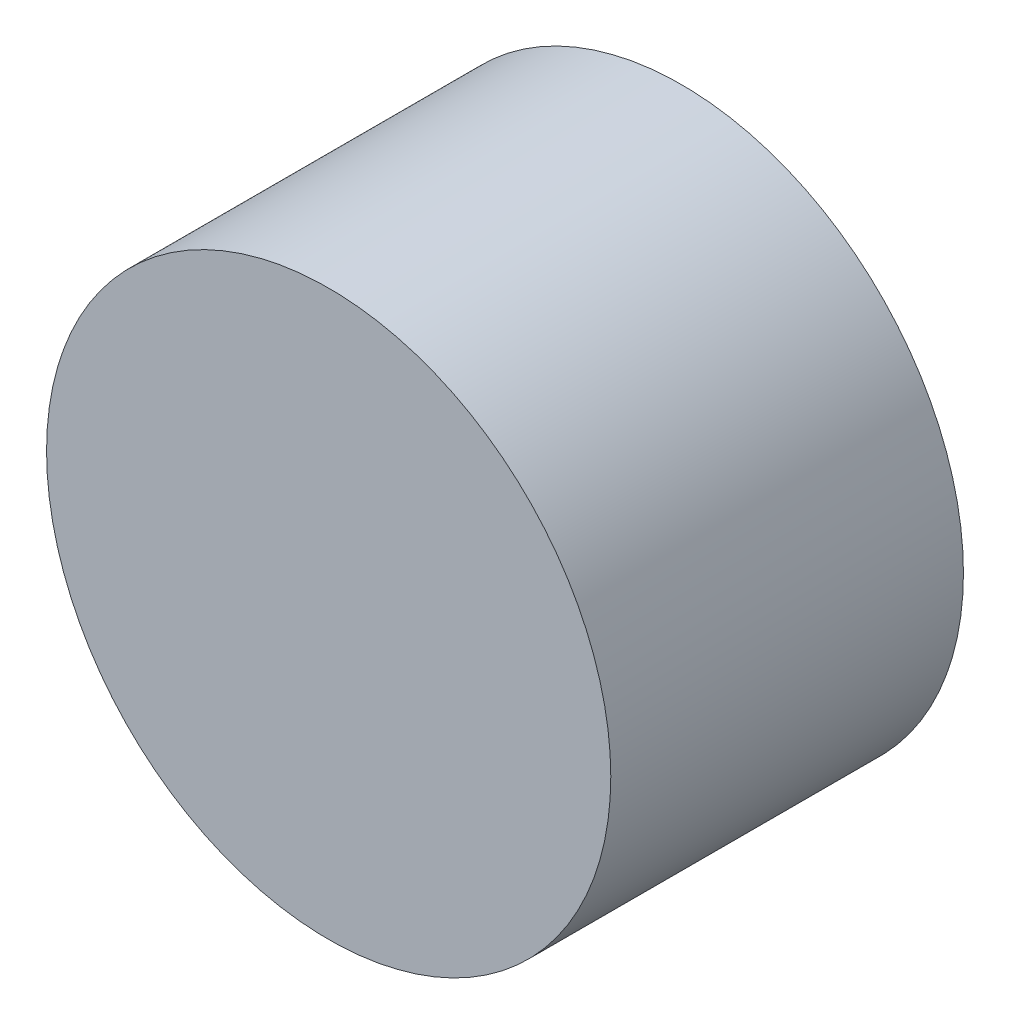
ISO-10303-21;
HEADER;
FILE_DESCRIPTION(('STEP AP214'),'2;1');
FILE_NAME('part.step','',(''),(''),'','','');
FILE_SCHEMA(('AUTOMOTIVE_DESIGN { 1 0 10303 214 1 1 1 1 }'));
ENDSEC;
DATA;
#1=APPLICATION_CONTEXT('core data for automotive mechanical design processes');
#2=APPLICATION_PROTOCOL_DEFINITION('international standard','automotive_design',2000,#1);
#3=PRODUCT_CONTEXT('',#1,'mechanical');
#4=PRODUCT('Part','Part','',(#3));
#5=PRODUCT_RELATED_PRODUCT_CATEGORY('part','',(#4));
#6=PRODUCT_DEFINITION_FORMATION('','',#4);
#7=PRODUCT_DEFINITION_CONTEXT('part definition',#1,'design');
#8=PRODUCT_DEFINITION('design','',#6,#7);
#9=PRODUCT_DEFINITION_SHAPE('','',#8);
#10=(LENGTH_UNIT() NAMED_UNIT(*) SI_UNIT(.MILLI.,.METRE.));
#11=(NAMED_UNIT(*) PLANE_ANGLE_UNIT() SI_UNIT($,.RADIAN.));
#12=(NAMED_UNIT(*) SI_UNIT($,.STERADIAN.) SOLID_ANGLE_UNIT());
#13=UNCERTAINTY_MEASURE_WITH_UNIT(LENGTH_MEASURE(1.E-05),#10,'distance_accuracy_value','');
#14=(GEOMETRIC_REPRESENTATION_CONTEXT(3) GLOBAL_UNCERTAINTY_ASSIGNED_CONTEXT((#13)) GLOBAL_UNIT_ASSIGNED_CONTEXT((#10,
#11,#12)) REPRESENTATION_CONTEXT('',''));
#15=CARTESIAN_POINT('',(0.,0.,0.));
#16=DIRECTION('',(0.,0.,1.));
#17=DIRECTION('',(1.,0.,0.));
#18=AXIS2_PLACEMENT_3D('',#15,#16,#17);
#19=CARTESIAN_POINT('',(0.,0.,50.));
#20=DIRECTION('',(0.,0.,-1.));
#21=DIRECTION('',(-1.,0.,0.));
#22=AXIS2_PLACEMENT_3D('',#19,#20,#21);
#23=CYLINDRICAL_SURFACE('',#22,40.);
#24=CARTESIAN_POINT('',(0.,0.,50.));
#25=DIRECTION('',(0.,0.,1.));
#26=DIRECTION('',(1.,0.,0.));
#27=AXIS2_PLACEMENT_3D('',#24,#25,#26);
#28=CIRCLE('',#27,40.);
#29=CARTESIAN_POINT('',(40.,0.,50.));
#30=VERTEX_POINT('',#29);
#31=EDGE_CURVE('E10',#30,#30,#28,.T.);
#32=ORIENTED_EDGE('',*,*,#31,.F.);
#33=EDGE_LOOP('',(#32));
#34=FACE_BOUND('',#33,.T.);
#35=CARTESIAN_POINT('',(0.,0.,0.));
#36=DIRECTION('',(0.,0.,1.));
#37=DIRECTION('',(1.,0.,0.));
#38=AXIS2_PLACEMENT_3D('',#35,#36,#37);
#39=CIRCLE('',#38,40.);
#40=CARTESIAN_POINT('',(40.,0.,0.));
#41=VERTEX_POINT('',#40);
#42=EDGE_CURVE('E37',#41,#41,#39,.T.);
#43=ORIENTED_EDGE('',*,*,#42,.T.);
#44=EDGE_LOOP('',(#43));
#45=FACE_BOUND('',#44,.T.);
#46=ADVANCED_FACE('F40',(#34,#45),#23,.T.);
#47=CARTESIAN_POINT('',(0.,0.,50.));
#48=DIRECTION('',(0.,0.,1.));
#49=DIRECTION('',(1.,0.,0.));
#50=AXIS2_PLACEMENT_3D('',#47,#48,#49);
#51=PLANE('',#50);
#52=ORIENTED_EDGE('',*,*,#31,.T.);
#53=EDGE_LOOP('',(#52));
#54=FACE_BOUND('',#53,.T.);
#55=ADVANCED_FACE('F55',(#54),#51,.T.);
#56=CARTESIAN_POINT('',(0.,0.,0.));
#57=DIRECTION('',(0.,0.,1.));
#58=DIRECTION('',(1.,0.,0.));
#59=AXIS2_PLACEMENT_3D('',#56,#57,#58);
#60=PLANE('',#59);
#61=ORIENTED_EDGE('',*,*,#42,.F.);
#62=EDGE_LOOP('',(#61));
#63=FACE_BOUND('',#62,.T.);
#64=ADVANCED_FACE('F49',(#63),#60,.F.);
#65=CLOSED_SHELL('',(#46,#55,#64));
#66=MANIFOLD_SOLID_BREP('B2',#65);
#67=ADVANCED_BREP_SHAPE_REPRESENTATION('',(#18,#66),#14);
#68=SHAPE_DEFINITION_REPRESENTATION(#9,#67);
ENDSEC;
END-ISO-10303-21;
